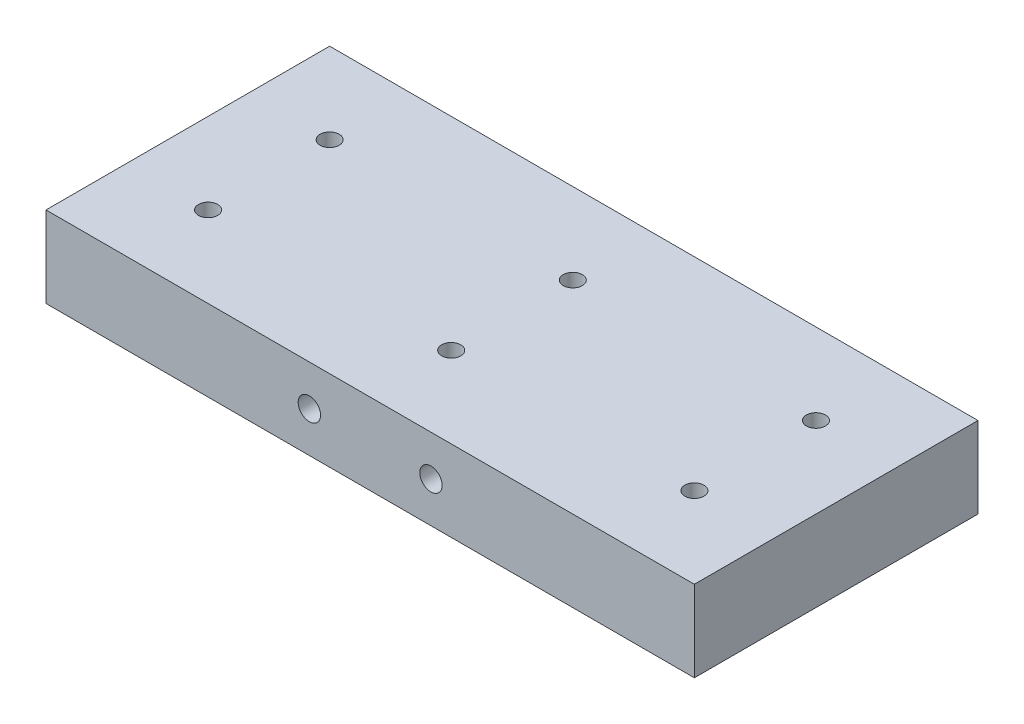
ISO-10303-21;
HEADER;
FILE_DESCRIPTION(('STEP AP214'),'2;1');
FILE_NAME('part.step','',(''),(''),'','','');
FILE_SCHEMA(('AUTOMOTIVE_DESIGN { 1 0 10303 214 1 1 1 1 }'));
ENDSEC;
DATA;
#1=APPLICATION_CONTEXT('core data for automotive mechanical design processes');
#2=APPLICATION_PROTOCOL_DEFINITION('international standard','automotive_design',2000,#1);
#3=PRODUCT_CONTEXT('',#1,'mechanical');
#4=PRODUCT('Part','Part','',(#3));
#5=PRODUCT_RELATED_PRODUCT_CATEGORY('part','',(#4));
#6=PRODUCT_DEFINITION_FORMATION('','',#4);
#7=PRODUCT_DEFINITION_CONTEXT('part definition',#1,'design');
#8=PRODUCT_DEFINITION('design','',#6,#7);
#9=PRODUCT_DEFINITION_SHAPE('','',#8);
#10=(LENGTH_UNIT() NAMED_UNIT(*) SI_UNIT(.MILLI.,.METRE.));
#11=(NAMED_UNIT(*) PLANE_ANGLE_UNIT() SI_UNIT($,.RADIAN.));
#12=(NAMED_UNIT(*) SI_UNIT($,.STERADIAN.) SOLID_ANGLE_UNIT());
#13=UNCERTAINTY_MEASURE_WITH_UNIT(LENGTH_MEASURE(1.E-05),#10,'distance_accuracy_value','');
#14=(GEOMETRIC_REPRESENTATION_CONTEXT(3) GLOBAL_UNCERTAINTY_ASSIGNED_CONTEXT((#13)) GLOBAL_UNIT_ASSIGNED_CONTEXT((#10,
#11,#12)) REPRESENTATION_CONTEXT('',''));
#15=CARTESIAN_POINT('',(0.,0.,0.));
#16=DIRECTION('',(0.,0.,1.));
#17=DIRECTION('',(1.,0.,0.));
#18=AXIS2_PLACEMENT_3D('',#15,#16,#17);
#19=CARTESIAN_POINT('',(50.8,-6.35,-22.2250000000001));
#20=DIRECTION('',(0.,0.,1.));
#21=DIRECTION('',(1.,0.,0.));
#22=AXIS2_PLACEMENT_3D('',#19,#20,#21);
#23=PLANE('',#22);
#24=CARTESIAN_POINT('',(-9.525,0.,-22.2250000000001));
#25=DIRECTION('',(0.,0.,1.));
#26=DIRECTION('',(1.,0.,0.));
#27=AXIS2_PLACEMENT_3D('',#24,#25,#26);
#28=CIRCLE('',#27,1.75513999999999);
#29=CARTESIAN_POINT('',(-7.76986000000001,0.,-22.2250000000001));
#30=VERTEX_POINT('',#29);
#31=EDGE_CURVE('E192',#30,#30,#28,.T.);
#32=ORIENTED_EDGE('',*,*,#31,.T.);
#33=EDGE_LOOP('',(#32));
#34=FACE_BOUND('',#33,.T.);
#35=CARTESIAN_POINT('',(9.525,0.,-22.2250000000001));
#36=DIRECTION('',(0.,0.,1.));
#37=DIRECTION('',(1.,0.,0.));
#38=AXIS2_PLACEMENT_3D('',#35,#36,#37);
#39=CIRCLE('',#38,1.75513999999999);
#40=CARTESIAN_POINT('',(11.28014,0.,-22.2250000000001));
#41=VERTEX_POINT('',#40);
#42=EDGE_CURVE('E116',#41,#41,#39,.T.);
#43=ORIENTED_EDGE('',*,*,#42,.T.);
#44=EDGE_LOOP('',(#43));
#45=FACE_BOUND('',#44,.T.);
#46=DIRECTION('',(0.,1.,0.));
#47=VECTOR('',#46,1.);
#48=CARTESIAN_POINT('',(-50.8,-6.35,-22.2250000000001));
#49=LINE('',#48,#47);
#50=CARTESIAN_POINT('',(-50.8,-6.35,-22.2250000000001));
#51=VERTEX_POINT('',#50);
#52=CARTESIAN_POINT('',(-50.8,6.35,-22.2250000000001));
#53=VERTEX_POINT('',#52);
#54=EDGE_CURVE('E146',#51,#53,#49,.T.);
#55=ORIENTED_EDGE('',*,*,#54,.T.);
#56=DIRECTION('',(-1.,0.,0.));
#57=VECTOR('',#56,1.);
#58=CARTESIAN_POINT('',(50.8,6.35,-22.2250000000001));
#59=LINE('',#58,#57);
#60=CARTESIAN_POINT('',(50.8,6.35,-22.2250000000001));
#61=VERTEX_POINT('',#60);
#62=EDGE_CURVE('E11',#61,#53,#59,.T.);
#63=ORIENTED_EDGE('',*,*,#62,.F.);
#64=DIRECTION('',(0.,1.,0.));
#65=VECTOR('',#64,1.);
#66=CARTESIAN_POINT('',(50.8,-6.35,-22.2250000000001));
#67=LINE('',#66,#65);
#68=CARTESIAN_POINT('',(50.8,-6.35,-22.2250000000001));
#69=VERTEX_POINT('',#68);
#70=EDGE_CURVE('E147',#69,#61,#67,.T.);
#71=ORIENTED_EDGE('',*,*,#70,.F.);
#72=DIRECTION('',(-1.,0.,0.));
#73=VECTOR('',#72,1.);
#74=CARTESIAN_POINT('',(50.8,-6.35,-22.2250000000001));
#75=LINE('',#74,#73);
#76=EDGE_CURVE('E153',#69,#51,#75,.T.);
#77=ORIENTED_EDGE('',*,*,#76,.T.);
#78=EDGE_LOOP('',(#55,#63,#71,#77));
#79=FACE_BOUND('',#78,.T.);
#80=ADVANCED_FACE('F33',(#34,#45,#79),#23,.F.);
#81=CARTESIAN_POINT('',(50.8,6.35,22.2250000000001));
#82=DIRECTION('',(0.,-1.,0.));
#83=DIRECTION('',(0.,0.,-1.));
#84=AXIS2_PLACEMENT_3D('',#81,#82,#83);
#85=PLANE('',#84);
#86=CARTESIAN_POINT('',(-38.1,6.35,9.52500000000001));
#87=DIRECTION('',(0.,1.,0.));
#88=DIRECTION('',(0.,0.,1.));
#89=AXIS2_PLACEMENT_3D('',#86,#87,#88);
#90=CIRCLE('',#89,1.49999999999999);
#91=CARTESIAN_POINT('',(-38.1,6.35,11.025));
#92=VERTEX_POINT('',#91);
#93=EDGE_CURVE('E110',#92,#92,#90,.T.);
#94=ORIENTED_EDGE('',*,*,#93,.F.);
#95=EDGE_LOOP('',(#94));
#96=FACE_BOUND('',#95,.T.);
#97=CARTESIAN_POINT('',(0.,6.35,9.52500000000001));
#98=DIRECTION('',(0.,1.,0.));
#99=DIRECTION('',(0.,0.,1.));
#100=AXIS2_PLACEMENT_3D('',#97,#98,#99);
#101=CIRCLE('',#100,1.49999999999999);
#102=CARTESIAN_POINT('',(0.,6.35,11.025));
#103=VERTEX_POINT('',#102);
#104=EDGE_CURVE('E109',#103,#103,#101,.T.);
#105=ORIENTED_EDGE('',*,*,#104,.F.);
#106=EDGE_LOOP('',(#105));
#107=FACE_BOUND('',#106,.T.);
#108=CARTESIAN_POINT('',(38.1,6.35,9.52500000000001));
#109=DIRECTION('',(0.,1.,0.));
#110=DIRECTION('',(0.,0.,1.));
#111=AXIS2_PLACEMENT_3D('',#108,#109,#110);
#112=CIRCLE('',#111,1.49999999999999);
#113=CARTESIAN_POINT('',(38.1,6.35,11.025));
#114=VERTEX_POINT('',#113);
#115=EDGE_CURVE('E122',#114,#114,#112,.T.);
#116=ORIENTED_EDGE('',*,*,#115,.F.);
#117=EDGE_LOOP('',(#116));
#118=FACE_BOUND('',#117,.T.);
#119=CARTESIAN_POINT('',(-38.1,6.35,-9.52500000000001));
#120=DIRECTION('',(0.,1.,0.));
#121=DIRECTION('',(0.,0.,1.));
#122=AXIS2_PLACEMENT_3D('',#119,#120,#121);
#123=CIRCLE('',#122,1.49999999999999);
#124=CARTESIAN_POINT('',(-38.1,6.35,-8.02500000000002));
#125=VERTEX_POINT('',#124);
#126=EDGE_CURVE('E128',#125,#125,#123,.T.);
#127=ORIENTED_EDGE('',*,*,#126,.F.);
#128=EDGE_LOOP('',(#127));
#129=FACE_BOUND('',#128,.T.);
#130=CARTESIAN_POINT('',(0.,6.35,-9.52500000000001));
#131=DIRECTION('',(0.,1.,0.));
#132=DIRECTION('',(0.,0.,1.));
#133=AXIS2_PLACEMENT_3D('',#130,#131,#132);
#134=CIRCLE('',#133,1.49999999999999);
#135=CARTESIAN_POINT('',(0.,6.35,-8.02500000000002));
#136=VERTEX_POINT('',#135);
#137=EDGE_CURVE('E134',#136,#136,#134,.T.);
#138=ORIENTED_EDGE('',*,*,#137,.F.);
#139=EDGE_LOOP('',(#138));
#140=FACE_BOUND('',#139,.T.);
#141=CARTESIAN_POINT('',(38.1,6.35,-9.52500000000001));
#142=DIRECTION('',(0.,1.,0.));
#143=DIRECTION('',(0.,0.,1.));
#144=AXIS2_PLACEMENT_3D('',#141,#142,#143);
#145=CIRCLE('',#144,1.49999999999999);
#146=CARTESIAN_POINT('',(38.1,6.35,-8.02500000000002));
#147=VERTEX_POINT('',#146);
#148=EDGE_CURVE('E140',#147,#147,#145,.T.);
#149=ORIENTED_EDGE('',*,*,#148,.F.);
#150=EDGE_LOOP('',(#149));
#151=FACE_BOUND('',#150,.T.);
#152=DIRECTION('',(0.,0.,1.));
#153=VECTOR('',#152,1.);
#154=CARTESIAN_POINT('',(-50.8,6.35,22.2250000000001));
#155=LINE('',#154,#153);
#156=CARTESIAN_POINT('',(-50.8,6.35,22.2250000000001));
#157=VERTEX_POINT('',#156);
#158=EDGE_CURVE('E156',#53,#157,#155,.T.);
#159=ORIENTED_EDGE('',*,*,#158,.T.);
#160=DIRECTION('',(-1.,0.,0.));
#161=VECTOR('',#160,1.);
#162=CARTESIAN_POINT('',(50.8,6.35,22.2250000000001));
#163=LINE('',#162,#161);
#164=CARTESIAN_POINT('',(50.8,6.35,22.2250000000001));
#165=VERTEX_POINT('',#164);
#166=EDGE_CURVE('E41',#165,#157,#163,.T.);
#167=ORIENTED_EDGE('',*,*,#166,.F.);
#168=DIRECTION('',(0.,0.,1.));
#169=VECTOR('',#168,1.);
#170=CARTESIAN_POINT('',(50.8,6.35,22.2250000000001));
#171=LINE('',#170,#169);
#172=EDGE_CURVE('E80',#61,#165,#171,.T.);
#173=ORIENTED_EDGE('',*,*,#172,.F.);
#174=ORIENTED_EDGE('',*,*,#62,.T.);
#175=EDGE_LOOP('',(#159,#167,#173,#174));
#176=FACE_BOUND('',#175,.T.);
#177=ADVANCED_FACE('F179',(#96,#107,#118,#129,#140,#151,#176),#85,.F.);
#178=CARTESIAN_POINT('',(50.8,-6.35,22.2250000000001));
#179=DIRECTION('',(0.,0.,-1.));
#180=DIRECTION('',(-1.,0.,0.));
#181=AXIS2_PLACEMENT_3D('',#178,#179,#180);
#182=PLANE('',#181);
#183=CARTESIAN_POINT('',(-9.525,0.,22.2250000000001));
#184=DIRECTION('',(0.,0.,1.));
#185=DIRECTION('',(1.,0.,0.));
#186=AXIS2_PLACEMENT_3D('',#183,#184,#185);
#187=CIRCLE('',#186,1.75514);
#188=CARTESIAN_POINT('',(-7.76986,0.,22.2250000000001));
#189=VERTEX_POINT('',#188);
#190=EDGE_CURVE('E201',#189,#189,#187,.T.);
#191=ORIENTED_EDGE('',*,*,#190,.F.);
#192=EDGE_LOOP('',(#191));
#193=FACE_BOUND('',#192,.T.);
#194=CARTESIAN_POINT('',(9.525,0.,22.2250000000001));
#195=DIRECTION('',(0.,0.,1.));
#196=DIRECTION('',(1.,0.,0.));
#197=AXIS2_PLACEMENT_3D('',#194,#195,#196);
#198=CIRCLE('',#197,1.75514);
#199=CARTESIAN_POINT('',(11.28014,0.,22.2250000000001));
#200=VERTEX_POINT('',#199);
#201=EDGE_CURVE('E196',#200,#200,#198,.T.);
#202=ORIENTED_EDGE('',*,*,#201,.F.);
#203=EDGE_LOOP('',(#202));
#204=FACE_BOUND('',#203,.T.);
#205=DIRECTION('',(0.,-1.,0.));
#206=VECTOR('',#205,1.);
#207=CARTESIAN_POINT('',(-50.8,-6.35,22.2250000000001));
#208=LINE('',#207,#206);
#209=CARTESIAN_POINT('',(-50.8,-6.35,22.2250000000001));
#210=VERTEX_POINT('',#209);
#211=EDGE_CURVE('E67',#157,#210,#208,.T.);
#212=ORIENTED_EDGE('',*,*,#211,.T.);
#213=DIRECTION('',(-1.,0.,0.));
#214=VECTOR('',#213,1.);
#215=CARTESIAN_POINT('',(50.8,-6.35,22.2250000000001));
#216=LINE('',#215,#214);
#217=CARTESIAN_POINT('',(50.8,-6.35,22.2250000000001));
#218=VERTEX_POINT('',#217);
#219=EDGE_CURVE('E161',#218,#210,#216,.T.);
#220=ORIENTED_EDGE('',*,*,#219,.F.);
#221=DIRECTION('',(0.,-1.,0.));
#222=VECTOR('',#221,1.);
#223=CARTESIAN_POINT('',(50.8,-6.35,22.2250000000001));
#224=LINE('',#223,#222);
#225=EDGE_CURVE('E150',#165,#218,#224,.T.);
#226=ORIENTED_EDGE('',*,*,#225,.F.);
#227=ORIENTED_EDGE('',*,*,#166,.T.);
#228=EDGE_LOOP('',(#212,#220,#226,#227));
#229=FACE_BOUND('',#228,.T.);
#230=ADVANCED_FACE('F163',(#193,#204,#229),#182,.F.);
#231=CARTESIAN_POINT('',(50.8,-6.35,22.2250000000001));
#232=DIRECTION('',(0.,1.,0.));
#233=DIRECTION('',(0.,0.,1.));
#234=AXIS2_PLACEMENT_3D('',#231,#232,#233);
#235=PLANE('',#234);
#236=DIRECTION('',(0.,0.,-1.));
#237=VECTOR('',#236,1.);
#238=CARTESIAN_POINT('',(-50.8,-6.35,22.2250000000001));
#239=LINE('',#238,#237);
#240=EDGE_CURVE('E73',#210,#51,#239,.T.);
#241=ORIENTED_EDGE('',*,*,#240,.T.);
#242=ORIENTED_EDGE('',*,*,#76,.F.);
#243=DIRECTION('',(0.,0.,-1.));
#244=VECTOR('',#243,1.);
#245=CARTESIAN_POINT('',(50.8,-6.35,22.2250000000001));
#246=LINE('',#245,#244);
#247=EDGE_CURVE('E49',#218,#69,#246,.T.);
#248=ORIENTED_EDGE('',*,*,#247,.F.);
#249=ORIENTED_EDGE('',*,*,#219,.T.);
#250=EDGE_LOOP('',(#241,#242,#248,#249));
#251=FACE_BOUND('',#250,.T.);
#252=ADVANCED_FACE('F170',(#251),#235,.F.);
#253=CARTESIAN_POINT('',(50.8,0.,0.));
#254=DIRECTION('',(-1.,0.,0.));
#255=DIRECTION('',(0.,0.,1.));
#256=AXIS2_PLACEMENT_3D('',#253,#254,#255);
#257=PLANE('',#256);
#258=ORIENTED_EDGE('',*,*,#70,.T.);
#259=ORIENTED_EDGE('',*,*,#172,.T.);
#260=ORIENTED_EDGE('',*,*,#225,.T.);
#261=ORIENTED_EDGE('',*,*,#247,.T.);
#262=EDGE_LOOP('',(#258,#259,#260,#261));
#263=FACE_BOUND('',#262,.T.);
#264=ADVANCED_FACE('F172',(#263),#257,.F.);
#265=CARTESIAN_POINT('',(-50.8,0.,0.));
#266=DIRECTION('',(-1.,0.,0.));
#267=DIRECTION('',(0.,0.,1.));
#268=AXIS2_PLACEMENT_3D('',#265,#266,#267);
#269=PLANE('',#268);
#270=ORIENTED_EDGE('',*,*,#54,.F.);
#271=ORIENTED_EDGE('',*,*,#240,.F.);
#272=ORIENTED_EDGE('',*,*,#211,.F.);
#273=ORIENTED_EDGE('',*,*,#158,.F.);
#274=EDGE_LOOP('',(#270,#271,#272,#273));
#275=FACE_BOUND('',#274,.T.);
#276=ADVANCED_FACE('F166',(#275),#269,.T.);
#277=CARTESIAN_POINT('',(38.1,0.,-9.52500000000001));
#278=DIRECTION('',(0.,1.,0.));
#279=DIRECTION('',(0.,0.,1.));
#280=AXIS2_PLACEMENT_3D('',#277,#278,#279);
#281=CONICAL_SURFACE('',#280,1.49999999999999,1.02974425867665);
#282=CARTESIAN_POINT('',(38.1,-0.90129092854134,-9.52500000000001));
#283=VERTEX_POINT('',#282);
#284=VERTEX_LOOP('',#283);
#285=FACE_BOUND('',#284,.T.);
#286=CARTESIAN_POINT('',(38.1,0.,-9.52500000000001));
#287=DIRECTION('',(0.,1.,0.));
#288=DIRECTION('',(0.,0.,1.));
#289=AXIS2_PLACEMENT_3D('',#286,#287,#288);
#290=CIRCLE('',#289,1.49999999999999);
#291=CARTESIAN_POINT('',(38.1,0.,-8.02500000000001));
#292=VERTEX_POINT('',#291);
#293=EDGE_CURVE('E143',#292,#292,#290,.T.);
#294=ORIENTED_EDGE('',*,*,#293,.T.);
#295=EDGE_LOOP('',(#294));
#296=FACE_BOUND('',#295,.T.);
#297=ADVANCED_FACE('F254',(#285,#296),#281,.F.);
#298=CARTESIAN_POINT('',(38.1,6.35,-9.52500000000001));
#299=DIRECTION('',(0.,1.,0.));
#300=DIRECTION('',(0.,0.,1.));
#301=AXIS2_PLACEMENT_3D('',#298,#299,#300);
#302=CYLINDRICAL_SURFACE('',#301,1.49999999999999);
#303=ORIENTED_EDGE('',*,*,#293,.F.);
#304=EDGE_LOOP('',(#303));
#305=FACE_BOUND('',#304,.T.);
#306=ORIENTED_EDGE('',*,*,#148,.T.);
#307=EDGE_LOOP('',(#306));
#308=FACE_BOUND('',#307,.T.);
#309=ADVANCED_FACE('F250',(#305,#308),#302,.F.);
#310=CARTESIAN_POINT('',(0.,0.,-9.52500000000001));
#311=DIRECTION('',(0.,1.,0.));
#312=DIRECTION('',(0.,0.,1.));
#313=AXIS2_PLACEMENT_3D('',#310,#311,#312);
#314=CONICAL_SURFACE('',#313,1.49999999999999,1.02974425867665);
#315=CARTESIAN_POINT('',(0.,-0.90129092854134,-9.52500000000001));
#316=VERTEX_POINT('',#315);
#317=VERTEX_LOOP('',#316);
#318=FACE_BOUND('',#317,.T.);
#319=CARTESIAN_POINT('',(0.,0.,-9.52500000000001));
#320=DIRECTION('',(0.,1.,0.));
#321=DIRECTION('',(0.,0.,1.));
#322=AXIS2_PLACEMENT_3D('',#319,#320,#321);
#323=CIRCLE('',#322,1.49999999999999);
#324=CARTESIAN_POINT('',(0.,0.,-8.02500000000001));
#325=VERTEX_POINT('',#324);
#326=EDGE_CURVE('E137',#325,#325,#323,.T.);
#327=ORIENTED_EDGE('',*,*,#326,.T.);
#328=EDGE_LOOP('',(#327));
#329=FACE_BOUND('',#328,.T.);
#330=ADVANCED_FACE('F246',(#318,#329),#314,.F.);
#331=CARTESIAN_POINT('',(0.,6.35,-9.52500000000001));
#332=DIRECTION('',(0.,1.,0.));
#333=DIRECTION('',(0.,0.,1.));
#334=AXIS2_PLACEMENT_3D('',#331,#332,#333);
#335=CYLINDRICAL_SURFACE('',#334,1.49999999999999);
#336=ORIENTED_EDGE('',*,*,#326,.F.);
#337=EDGE_LOOP('',(#336));
#338=FACE_BOUND('',#337,.T.);
#339=ORIENTED_EDGE('',*,*,#137,.T.);
#340=EDGE_LOOP('',(#339));
#341=FACE_BOUND('',#340,.T.);
#342=ADVANCED_FACE('F242',(#338,#341),#335,.F.);
#343=CARTESIAN_POINT('',(-38.1,0.,-9.52500000000001));
#344=DIRECTION('',(0.,1.,0.));
#345=DIRECTION('',(0.,0.,1.));
#346=AXIS2_PLACEMENT_3D('',#343,#344,#345);
#347=CONICAL_SURFACE('',#346,1.49999999999999,1.02974425867665);
#348=CARTESIAN_POINT('',(-38.1,-0.90129092854134,-9.52500000000001));
#349=VERTEX_POINT('',#348);
#350=VERTEX_LOOP('',#349);
#351=FACE_BOUND('',#350,.T.);
#352=CARTESIAN_POINT('',(-38.1,0.,-9.52500000000001));
#353=DIRECTION('',(0.,1.,0.));
#354=DIRECTION('',(0.,0.,1.));
#355=AXIS2_PLACEMENT_3D('',#352,#353,#354);
#356=CIRCLE('',#355,1.49999999999999);
#357=CARTESIAN_POINT('',(-38.1,0.,-8.02500000000001));
#358=VERTEX_POINT('',#357);
#359=EDGE_CURVE('E131',#358,#358,#356,.T.);
#360=ORIENTED_EDGE('',*,*,#359,.T.);
#361=EDGE_LOOP('',(#360));
#362=FACE_BOUND('',#361,.T.);
#363=ADVANCED_FACE('F238',(#351,#362),#347,.F.);
#364=CARTESIAN_POINT('',(-38.1,6.35,-9.52500000000001));
#365=DIRECTION('',(0.,1.,0.));
#366=DIRECTION('',(0.,0.,1.));
#367=AXIS2_PLACEMENT_3D('',#364,#365,#366);
#368=CYLINDRICAL_SURFACE('',#367,1.49999999999999);
#369=ORIENTED_EDGE('',*,*,#359,.F.);
#370=EDGE_LOOP('',(#369));
#371=FACE_BOUND('',#370,.T.);
#372=ORIENTED_EDGE('',*,*,#126,.T.);
#373=EDGE_LOOP('',(#372));
#374=FACE_BOUND('',#373,.T.);
#375=ADVANCED_FACE('F234',(#371,#374),#368,.F.);
#376=CARTESIAN_POINT('',(38.1,0.,9.52500000000001));
#377=DIRECTION('',(0.,1.,0.));
#378=DIRECTION('',(0.,0.,1.));
#379=AXIS2_PLACEMENT_3D('',#376,#377,#378);
#380=CONICAL_SURFACE('',#379,1.49999999999999,1.02974425867665);
#381=CARTESIAN_POINT('',(38.1,-0.90129092854134,9.52500000000001));
#382=VERTEX_POINT('',#381);
#383=VERTEX_LOOP('',#382);
#384=FACE_BOUND('',#383,.T.);
#385=CARTESIAN_POINT('',(38.1,0.,9.52500000000001));
#386=DIRECTION('',(0.,1.,0.));
#387=DIRECTION('',(0.,0.,1.));
#388=AXIS2_PLACEMENT_3D('',#385,#386,#387);
#389=CIRCLE('',#388,1.49999999999999);
#390=CARTESIAN_POINT('',(38.1,0.,11.025));
#391=VERTEX_POINT('',#390);
#392=EDGE_CURVE('E125',#391,#391,#389,.T.);
#393=ORIENTED_EDGE('',*,*,#392,.T.);
#394=EDGE_LOOP('',(#393));
#395=FACE_BOUND('',#394,.T.);
#396=ADVANCED_FACE('F230',(#384,#395),#380,.F.);
#397=CARTESIAN_POINT('',(38.1,6.35,9.52500000000001));
#398=DIRECTION('',(0.,1.,0.));
#399=DIRECTION('',(0.,0.,1.));
#400=AXIS2_PLACEMENT_3D('',#397,#398,#399);
#401=CYLINDRICAL_SURFACE('',#400,1.49999999999999);
#402=ORIENTED_EDGE('',*,*,#392,.F.);
#403=EDGE_LOOP('',(#402));
#404=FACE_BOUND('',#403,.T.);
#405=ORIENTED_EDGE('',*,*,#115,.T.);
#406=EDGE_LOOP('',(#405));
#407=FACE_BOUND('',#406,.T.);
#408=ADVANCED_FACE('F226',(#404,#407),#401,.F.);
#409=CARTESIAN_POINT('',(0.,0.,9.52500000000001));
#410=DIRECTION('',(0.,1.,0.));
#411=DIRECTION('',(0.,0.,1.));
#412=AXIS2_PLACEMENT_3D('',#409,#410,#411);
#413=CONICAL_SURFACE('',#412,1.49999999999999,1.02974425867665);
#414=CARTESIAN_POINT('',(0.,-0.90129092854134,9.52500000000001));
#415=VERTEX_POINT('',#414);
#416=VERTEX_LOOP('',#415);
#417=FACE_BOUND('',#416,.T.);
#418=CARTESIAN_POINT('',(0.,0.,9.52500000000001));
#419=DIRECTION('',(0.,1.,0.));
#420=DIRECTION('',(0.,0.,1.));
#421=AXIS2_PLACEMENT_3D('',#418,#419,#420);
#422=CIRCLE('',#421,1.49999999999999);
#423=CARTESIAN_POINT('',(0.,0.,11.025));
#424=VERTEX_POINT('',#423);
#425=EDGE_CURVE('E113',#424,#424,#422,.T.);
#426=ORIENTED_EDGE('',*,*,#425,.T.);
#427=EDGE_LOOP('',(#426));
#428=FACE_BOUND('',#427,.T.);
#429=ADVANCED_FACE('F222',(#417,#428),#413,.F.);
#430=CARTESIAN_POINT('',(0.,6.35,9.52500000000001));
#431=DIRECTION('',(0.,1.,0.));
#432=DIRECTION('',(0.,0.,1.));
#433=AXIS2_PLACEMENT_3D('',#430,#431,#432);
#434=CYLINDRICAL_SURFACE('',#433,1.49999999999999);
#435=ORIENTED_EDGE('',*,*,#425,.F.);
#436=EDGE_LOOP('',(#435));
#437=FACE_BOUND('',#436,.T.);
#438=ORIENTED_EDGE('',*,*,#104,.T.);
#439=EDGE_LOOP('',(#438));
#440=FACE_BOUND('',#439,.T.);
#441=ADVANCED_FACE('F103',(#437,#440),#434,.F.);
#442=CARTESIAN_POINT('',(-38.1,0.,9.52500000000001));
#443=DIRECTION('',(0.,1.,0.));
#444=DIRECTION('',(0.,0.,1.));
#445=AXIS2_PLACEMENT_3D('',#442,#443,#444);
#446=CONICAL_SURFACE('',#445,1.49999999999999,1.02974425867665);
#447=CARTESIAN_POINT('',(-38.1,-0.90129092854134,9.52500000000001));
#448=VERTEX_POINT('',#447);
#449=VERTEX_LOOP('',#448);
#450=FACE_BOUND('',#449,.T.);
#451=CARTESIAN_POINT('',(-38.1,0.,9.52500000000001));
#452=DIRECTION('',(0.,1.,0.));
#453=DIRECTION('',(0.,0.,1.));
#454=AXIS2_PLACEMENT_3D('',#451,#452,#453);
#455=CIRCLE('',#454,1.49999999999999);
#456=CARTESIAN_POINT('',(-38.1,0.,11.025));
#457=VERTEX_POINT('',#456);
#458=EDGE_CURVE('E107',#457,#457,#455,.T.);
#459=ORIENTED_EDGE('',*,*,#458,.T.);
#460=EDGE_LOOP('',(#459));
#461=FACE_BOUND('',#460,.T.);
#462=ADVANCED_FACE('F99',(#450,#461),#446,.F.);
#463=CARTESIAN_POINT('',(-38.1,6.35,9.52500000000001));
#464=DIRECTION('',(0.,1.,0.));
#465=DIRECTION('',(0.,0.,1.));
#466=AXIS2_PLACEMENT_3D('',#463,#464,#465);
#467=CYLINDRICAL_SURFACE('',#466,1.49999999999999);
#468=ORIENTED_EDGE('',*,*,#458,.F.);
#469=EDGE_LOOP('',(#468));
#470=FACE_BOUND('',#469,.T.);
#471=ORIENTED_EDGE('',*,*,#93,.T.);
#472=EDGE_LOOP('',(#471));
#473=FACE_BOUND('',#472,.T.);
#474=ADVANCED_FACE('F102',(#470,#473),#467,.F.);
#475=CARTESIAN_POINT('',(9.525,0.,22.2250000000001));
#476=DIRECTION('',(0.,0.,1.));
#477=DIRECTION('',(1.,0.,0.));
#478=AXIS2_PLACEMENT_3D('',#475,#476,#477);
#479=CYLINDRICAL_SURFACE('',#478,1.75513999999999);
#480=ORIENTED_EDGE('',*,*,#42,.F.);
#481=EDGE_LOOP('',(#480));
#482=FACE_BOUND('',#481,.T.);
#483=ORIENTED_EDGE('',*,*,#201,.T.);
#484=EDGE_LOOP('',(#483));
#485=FACE_BOUND('',#484,.T.);
#486=ADVANCED_FACE('F209',(#482,#485),#479,.F.);
#487=CARTESIAN_POINT('',(-9.525,0.,22.2250000000001));
#488=DIRECTION('',(0.,0.,1.));
#489=DIRECTION('',(1.,0.,0.));
#490=AXIS2_PLACEMENT_3D('',#487,#488,#489);
#491=CYLINDRICAL_SURFACE('',#490,1.75513999999999);
#492=ORIENTED_EDGE('',*,*,#31,.F.);
#493=EDGE_LOOP('',(#492));
#494=FACE_BOUND('',#493,.T.);
#495=ORIENTED_EDGE('',*,*,#190,.T.);
#496=EDGE_LOOP('',(#495));
#497=FACE_BOUND('',#496,.T.);
#498=ADVANCED_FACE('F205',(#494,#497),#491,.F.);
#499=CLOSED_SHELL('',(#80,#177,#230,#252,#264,#276,#297,#309,#330,#342,#363,#375,#396,#408,#429,
#441,#462,#474,#486,#498));
#500=MANIFOLD_SOLID_BREP('B2',#499);
#501=ADVANCED_BREP_SHAPE_REPRESENTATION('',(#18,#500),#14);
#502=SHAPE_DEFINITION_REPRESENTATION(#9,#501);
ENDSEC;
END-ISO-10303-21;
